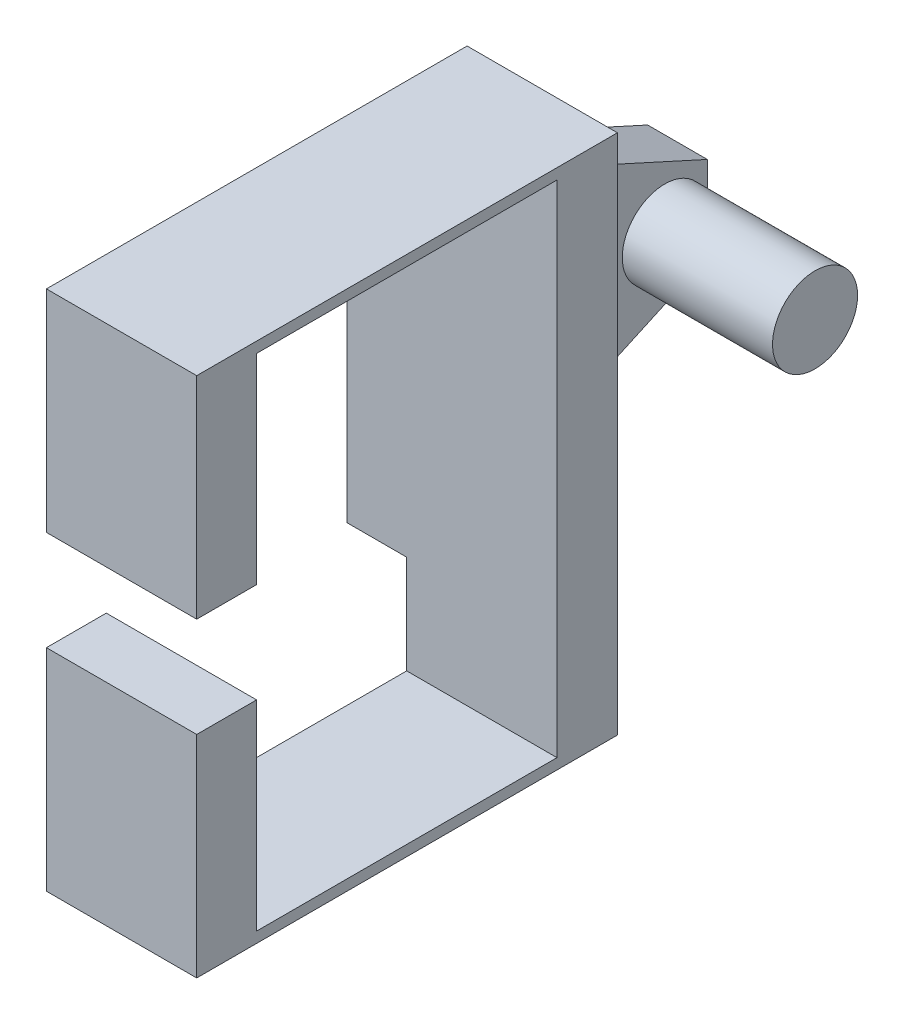
ISO-10303-21;
HEADER;
FILE_DESCRIPTION(('STEP AP214'),'2;1');
FILE_NAME('part.step','',(''),(''),'','','');
FILE_SCHEMA(('AUTOMOTIVE_DESIGN { 1 0 10303 214 1 1 1 1 }'));
ENDSEC;
DATA;
#1=APPLICATION_CONTEXT('core data for automotive mechanical design processes');
#2=APPLICATION_PROTOCOL_DEFINITION('international standard','automotive_design',2000,#1);
#3=PRODUCT_CONTEXT('',#1,'mechanical');
#4=PRODUCT('Part','Part','',(#3));
#5=PRODUCT_RELATED_PRODUCT_CATEGORY('part','',(#4));
#6=PRODUCT_DEFINITION_FORMATION('','',#4);
#7=PRODUCT_DEFINITION_CONTEXT('part definition',#1,'design');
#8=PRODUCT_DEFINITION('design','',#6,#7);
#9=PRODUCT_DEFINITION_SHAPE('','',#8);
#10=(LENGTH_UNIT() NAMED_UNIT(*) SI_UNIT(.MILLI.,.METRE.));
#11=(NAMED_UNIT(*) PLANE_ANGLE_UNIT() SI_UNIT($,.RADIAN.));
#12=(NAMED_UNIT(*) SI_UNIT($,.STERADIAN.) SOLID_ANGLE_UNIT());
#13=UNCERTAINTY_MEASURE_WITH_UNIT(LENGTH_MEASURE(1.E-05),#10,'distance_accuracy_value','');
#14=(GEOMETRIC_REPRESENTATION_CONTEXT(3) GLOBAL_UNCERTAINTY_ASSIGNED_CONTEXT((#13)) GLOBAL_UNIT_ASSIGNED_CONTEXT((#10,
#11,#12)) REPRESENTATION_CONTEXT('',''));
#15=CARTESIAN_POINT('',(0.,0.,0.));
#16=DIRECTION('',(0.,0.,1.));
#17=DIRECTION('',(1.,0.,0.));
#18=AXIS2_PLACEMENT_3D('',#15,#16,#17);
#19=CARTESIAN_POINT('',(0.,0.,0.));
#20=DIRECTION('',(1.,0.,0.));
#21=DIRECTION('',(0.,0.,-1.));
#22=AXIS2_PLACEMENT_3D('',#19,#20,#21);
#23=PLANE('',#22);
#24=DIRECTION('',(0.,0.,1.));
#25=VECTOR('',#24,1.);
#26=CARTESIAN_POINT('',(0.,13.8350809128518,0.));
#27=LINE('',#26,#25);
#28=CARTESIAN_POINT('',(0.,13.8350809128518,0.));
#29=VERTEX_POINT('',#28);
#30=CARTESIAN_POINT('',(0.,13.8350809128518,7.65751071235147));
#31=VERTEX_POINT('',#30);
#32=EDGE_CURVE('E207',#29,#31,#27,.T.);
#33=ORIENTED_EDGE('',*,*,#32,.F.);
#34=DIRECTION('',(0.,1.,0.));
#35=VECTOR('',#34,1.);
#36=CARTESIAN_POINT('',(0.,0.,0.));
#37=LINE('',#36,#35);
#38=CARTESIAN_POINT('',(0.,0.,0.));
#39=VERTEX_POINT('',#38);
#40=EDGE_CURVE('E262',#39,#29,#37,.T.);
#41=ORIENTED_EDGE('',*,*,#40,.F.);
#42=DIRECTION('',(0.,0.,-1.));
#43=VECTOR('',#42,1.);
#44=CARTESIAN_POINT('',(0.,0.,0.));
#45=LINE('',#44,#43);
#46=CARTESIAN_POINT('',(0.,0.,53.3205661447543));
#47=VERTEX_POINT('',#46);
#48=EDGE_CURVE('E242',#47,#39,#45,.T.);
#49=ORIENTED_EDGE('',*,*,#48,.F.);
#50=DIRECTION('',(0.,-1.,0.));
#51=VECTOR('',#50,1.);
#52=CARTESIAN_POINT('',(0.,0.,53.3205661447543));
#53=LINE('',#52,#51);
#54=CARTESIAN_POINT('',(0.,26.7343466598933,53.3205661447543));
#55=VERTEX_POINT('',#54);
#56=EDGE_CURVE('E288',#55,#47,#53,.T.);
#57=ORIENTED_EDGE('',*,*,#56,.F.);
#58=DIRECTION('',(0.,0.,1.));
#59=VECTOR('',#58,1.);
#60=CARTESIAN_POINT('',(0.,26.7343466598933,53.3205661447543));
#61=LINE('',#60,#59);
#62=CARTESIAN_POINT('',(0.,26.7343466598933,45.7321107123515));
#63=VERTEX_POINT('',#62);
#64=EDGE_CURVE('E284',#63,#55,#61,.T.);
#65=ORIENTED_EDGE('',*,*,#64,.F.);
#66=DIRECTION('',(0.,1.,0.));
#67=VECTOR('',#66,1.);
#68=CARTESIAN_POINT('',(0.,26.7343466598933,45.7321107123515));
#69=LINE('',#68,#67);
#70=CARTESIAN_POINT('',(0.,1.35466665989334,45.7321107123515));
#71=VERTEX_POINT('',#70);
#72=EDGE_CURVE('E285',#71,#63,#69,.T.);
#73=ORIENTED_EDGE('',*,*,#72,.F.);
#74=DIRECTION('',(0.,0.,1.));
#75=VECTOR('',#74,1.);
#76=CARTESIAN_POINT('',(0.,1.35466665989334,45.7321107123515));
#77=LINE('',#76,#75);
#78=CARTESIAN_POINT('',(0.,1.35466665989335,7.65751071235147));
#79=VERTEX_POINT('',#78);
#80=EDGE_CURVE('E278',#79,#71,#77,.T.);
#81=ORIENTED_EDGE('',*,*,#80,.F.);
#82=DIRECTION('',(0.,-1.,0.));
#83=VECTOR('',#82,1.);
#84=CARTESIAN_POINT('',(0.,1.35466665989335,7.65751071235147));
#85=LINE('',#84,#83);
#86=EDGE_CURVE('E280',#31,#79,#85,.T.);
#87=ORIENTED_EDGE('',*,*,#86,.F.);
#88=EDGE_LOOP('',(#33,#41,#49,#57,#65,#73,#81,#87));
#89=FACE_BOUND('',#88,.T.);
#90=ADVANCED_FACE('F44',(#89),#23,.F.);
#91=DIRECTION('',(0.,0.,-1.));
#92=VECTOR('',#91,1.);
#93=CARTESIAN_POINT('',(0.,52.2828124069349,0.));
#94=LINE('',#93,#92);
#95=CARTESIAN_POINT('',(0.,52.2828124069349,7.65751071235147));
#96=VERTEX_POINT('',#95);
#97=CARTESIAN_POINT('',(0.,52.2828124069349,0.));
#98=VERTEX_POINT('',#97);
#99=EDGE_CURVE('E66',#96,#98,#94,.T.);
#100=ORIENTED_EDGE('',*,*,#99,.F.);
#101=CARTESIAN_POINT('',(0.,64.7632266598933,7.65751071235147));
#102=VERTEX_POINT('',#101);
#103=EDGE_CURVE('E279',#102,#96,#85,.T.);
#104=ORIENTED_EDGE('',*,*,#103,.F.);
#105=DIRECTION('',(0.,0.,-1.));
#106=VECTOR('',#105,1.);
#107=CARTESIAN_POINT('',(0.,64.7632266598933,45.7321107123515));
#108=LINE('',#107,#106);
#109=CARTESIAN_POINT('',(0.,64.7632266598933,45.7321107123515));
#110=VERTEX_POINT('',#109);
#111=EDGE_CURVE('E274',#110,#102,#108,.T.);
#112=ORIENTED_EDGE('',*,*,#111,.F.);
#113=DIRECTION('',(0.,1.,0.));
#114=VECTOR('',#113,1.);
#115=CARTESIAN_POINT('',(0.,39.3835466598933,45.7321107123515));
#116=LINE('',#115,#114);
#117=CARTESIAN_POINT('',(0.,39.3835466598933,45.7321107123515));
#118=VERTEX_POINT('',#117);
#119=EDGE_CURVE('E272',#118,#110,#116,.T.);
#120=ORIENTED_EDGE('',*,*,#119,.F.);
#121=DIRECTION('',(0.,0.,-1.));
#122=VECTOR('',#121,1.);
#123=CARTESIAN_POINT('',(0.,39.3835466598933,53.3205661447543));
#124=LINE('',#123,#122);
#125=CARTESIAN_POINT('',(0.,39.3835466598933,53.3205661447543));
#126=VERTEX_POINT('',#125);
#127=EDGE_CURVE('E271',#126,#118,#124,.T.);
#128=ORIENTED_EDGE('',*,*,#127,.F.);
#129=DIRECTION('',(0.,-1.,0.));
#130=VECTOR('',#129,1.);
#131=CARTESIAN_POINT('',(0.,66.1178933197867,53.3205661447543));
#132=LINE('',#131,#130);
#133=CARTESIAN_POINT('',(0.,66.1178933197867,53.3205661447543));
#134=VERTEX_POINT('',#133);
#135=EDGE_CURVE('E267',#134,#126,#132,.T.);
#136=ORIENTED_EDGE('',*,*,#135,.F.);
#137=DIRECTION('',(0.,0.,1.));
#138=VECTOR('',#137,1.);
#139=CARTESIAN_POINT('',(0.,66.1178933197867,0.));
#140=LINE('',#139,#138);
#141=CARTESIAN_POINT('',(0.,66.1178933197867,0.));
#142=VERTEX_POINT('',#141);
#143=EDGE_CURVE('E270',#142,#134,#140,.T.);
#144=ORIENTED_EDGE('',*,*,#143,.F.);
#145=EDGE_CURVE('E237',#98,#142,#37,.T.);
#146=ORIENTED_EDGE('',*,*,#145,.F.);
#147=EDGE_LOOP('',(#100,#104,#112,#120,#128,#136,#144,#146));
#148=FACE_BOUND('',#147,.T.);
#149=ADVANCED_FACE('F330',(#148),#23,.F.);
#150=CARTESIAN_POINT('',(19.05,0.,0.));
#151=DIRECTION('',(0.,0.,1.));
#152=DIRECTION('',(1.,0.,0.));
#153=AXIS2_PLACEMENT_3D('',#150,#151,#152);
#154=PLANE('',#153);
#155=ORIENTED_EDGE('',*,*,#40,.T.);
#156=EDGE_CURVE('E58',#29,#98,#37,.T.);
#157=ORIENTED_EDGE('',*,*,#156,.T.);
#158=ORIENTED_EDGE('',*,*,#145,.T.);
#159=DIRECTION('',(-1.,0.,0.));
#160=VECTOR('',#159,1.);
#161=CARTESIAN_POINT('',(19.05,66.1178933197867,0.));
#162=LINE('',#161,#160);
#163=CARTESIAN_POINT('',(19.05,66.1178933197867,0.));
#164=VERTEX_POINT('',#163);
#165=EDGE_CURVE('E11',#164,#142,#162,.T.);
#166=ORIENTED_EDGE('',*,*,#165,.F.);
#167=DIRECTION('',(0.,1.,0.));
#168=VECTOR('',#167,1.);
#169=CARTESIAN_POINT('',(19.05,0.,0.));
#170=LINE('',#169,#168);
#171=CARTESIAN_POINT('',(19.05,0.,0.));
#172=VERTEX_POINT('',#171);
#173=EDGE_CURVE('E240',#172,#164,#170,.T.);
#174=ORIENTED_EDGE('',*,*,#173,.F.);
#175=DIRECTION('',(-1.,0.,0.));
#176=VECTOR('',#175,1.);
#177=CARTESIAN_POINT('',(19.05,0.,0.));
#178=LINE('',#177,#176);
#179=EDGE_CURVE('E263',#172,#39,#178,.T.);
#180=ORIENTED_EDGE('',*,*,#179,.T.);
#181=EDGE_LOOP('',(#155,#157,#158,#166,#174,#180));
#182=FACE_BOUND('',#181,.T.);
#183=ADVANCED_FACE('F50',(#182),#154,.F.);
#184=CARTESIAN_POINT('',(19.05,66.1178933197867,0.));
#185=DIRECTION('',(0.,-1.,0.));
#186=DIRECTION('',(0.,0.,-1.));
#187=AXIS2_PLACEMENT_3D('',#184,#185,#186);
#188=PLANE('',#187);
#189=ORIENTED_EDGE('',*,*,#143,.T.);
#190=DIRECTION('',(-1.,0.,0.));
#191=VECTOR('',#190,1.);
#192=CARTESIAN_POINT('',(19.05,66.1178933197867,53.3205661447543));
#193=LINE('',#192,#191);
#194=CARTESIAN_POINT('',(19.05,66.1178933197867,53.3205661447543));
#195=VERTEX_POINT('',#194);
#196=EDGE_CURVE('E52',#195,#134,#193,.T.);
#197=ORIENTED_EDGE('',*,*,#196,.F.);
#198=DIRECTION('',(0.,0.,1.));
#199=VECTOR('',#198,1.);
#200=CARTESIAN_POINT('',(19.05,66.1178933197867,0.));
#201=LINE('',#200,#199);
#202=EDGE_CURVE('E238',#164,#195,#201,.T.);
#203=ORIENTED_EDGE('',*,*,#202,.F.);
#204=ORIENTED_EDGE('',*,*,#165,.T.);
#205=EDGE_LOOP('',(#189,#197,#203,#204));
#206=FACE_BOUND('',#205,.T.);
#207=ADVANCED_FACE('F342',(#206),#188,.F.);
#208=CARTESIAN_POINT('',(19.05,66.1178933197867,53.3205661447543));
#209=DIRECTION('',(0.,0.,-1.));
#210=DIRECTION('',(-1.,0.,0.));
#211=AXIS2_PLACEMENT_3D('',#208,#209,#210);
#212=PLANE('',#211);
#213=ORIENTED_EDGE('',*,*,#135,.T.);
#214=DIRECTION('',(-1.,0.,0.));
#215=VECTOR('',#214,1.);
#216=CARTESIAN_POINT('',(19.05,39.3835466598933,53.3205661447543));
#217=LINE('',#216,#215);
#218=CARTESIAN_POINT('',(19.05,39.3835466598933,53.3205661447543));
#219=VERTEX_POINT('',#218);
#220=EDGE_CURVE('E312',#219,#126,#217,.T.);
#221=ORIENTED_EDGE('',*,*,#220,.F.);
#222=DIRECTION('',(0.,-1.,0.));
#223=VECTOR('',#222,1.);
#224=CARTESIAN_POINT('',(19.05,66.1178933197867,53.3205661447543));
#225=LINE('',#224,#223);
#226=EDGE_CURVE('E243',#195,#219,#225,.T.);
#227=ORIENTED_EDGE('',*,*,#226,.F.);
#228=ORIENTED_EDGE('',*,*,#196,.T.);
#229=EDGE_LOOP('',(#213,#221,#227,#228));
#230=FACE_BOUND('',#229,.T.);
#231=ADVANCED_FACE('F325',(#230),#212,.F.);
#232=CARTESIAN_POINT('',(19.05,39.3835466598933,53.3205661447543));
#233=DIRECTION('',(0.,1.,0.));
#234=DIRECTION('',(0.,0.,1.));
#235=AXIS2_PLACEMENT_3D('',#232,#233,#234);
#236=PLANE('',#235);
#237=ORIENTED_EDGE('',*,*,#127,.T.);
#238=DIRECTION('',(-1.,0.,0.));
#239=VECTOR('',#238,1.);
#240=CARTESIAN_POINT('',(19.05,39.3835466598933,45.7321107123515));
#241=LINE('',#240,#239);
#242=CARTESIAN_POINT('',(19.05,39.3835466598933,45.7321107123515));
#243=VERTEX_POINT('',#242);
#244=EDGE_CURVE('E315',#243,#118,#241,.T.);
#245=ORIENTED_EDGE('',*,*,#244,.F.);
#246=DIRECTION('',(0.,0.,-1.));
#247=VECTOR('',#246,1.);
#248=CARTESIAN_POINT('',(19.05,39.3835466598933,53.3205661447543));
#249=LINE('',#248,#247);
#250=EDGE_CURVE('E241',#219,#243,#249,.T.);
#251=ORIENTED_EDGE('',*,*,#250,.F.);
#252=ORIENTED_EDGE('',*,*,#220,.T.);
#253=EDGE_LOOP('',(#237,#245,#251,#252));
#254=FACE_BOUND('',#253,.T.);
#255=ADVANCED_FACE('F335',(#254),#236,.F.);
#256=CARTESIAN_POINT('',(19.05,39.3835466598933,45.7321107123515));
#257=DIRECTION('',(0.,0.,1.));
#258=DIRECTION('',(1.,0.,0.));
#259=AXIS2_PLACEMENT_3D('',#256,#257,#258);
#260=PLANE('',#259);
#261=ORIENTED_EDGE('',*,*,#119,.T.);
#262=DIRECTION('',(-1.,0.,0.));
#263=VECTOR('',#262,1.);
#264=CARTESIAN_POINT('',(19.05,64.7632266598933,45.7321107123515));
#265=LINE('',#264,#263);
#266=CARTESIAN_POINT('',(19.05,64.7632266598933,45.7321107123515));
#267=VERTEX_POINT('',#266);
#268=EDGE_CURVE('E310',#267,#110,#265,.T.);
#269=ORIENTED_EDGE('',*,*,#268,.F.);
#270=DIRECTION('',(0.,1.,0.));
#271=VECTOR('',#270,1.);
#272=CARTESIAN_POINT('',(19.05,39.3835466598933,45.7321107123515));
#273=LINE('',#272,#271);
#274=EDGE_CURVE('E250',#243,#267,#273,.T.);
#275=ORIENTED_EDGE('',*,*,#274,.F.);
#276=ORIENTED_EDGE('',*,*,#244,.T.);
#277=EDGE_LOOP('',(#261,#269,#275,#276));
#278=FACE_BOUND('',#277,.T.);
#279=ADVANCED_FACE('F337',(#278),#260,.F.);
#280=CARTESIAN_POINT('',(19.05,64.7632266598933,45.7321107123515));
#281=DIRECTION('',(0.,1.,0.));
#282=DIRECTION('',(0.,0.,1.));
#283=AXIS2_PLACEMENT_3D('',#280,#281,#282);
#284=PLANE('',#283);
#285=ORIENTED_EDGE('',*,*,#111,.T.);
#286=DIRECTION('',(-1.,0.,0.));
#287=VECTOR('',#286,1.);
#288=CARTESIAN_POINT('',(19.05,64.7632266598933,7.65751071235147));
#289=LINE('',#288,#287);
#290=CARTESIAN_POINT('',(19.05,64.7632266598933,7.65751071235147));
#291=VERTEX_POINT('',#290);
#292=EDGE_CURVE('E308',#291,#102,#289,.T.);
#293=ORIENTED_EDGE('',*,*,#292,.F.);
#294=DIRECTION('',(0.,0.,-1.));
#295=VECTOR('',#294,1.);
#296=CARTESIAN_POINT('',(19.05,64.7632266598933,45.7321107123515));
#297=LINE('',#296,#295);
#298=EDGE_CURVE('E247',#267,#291,#297,.T.);
#299=ORIENTED_EDGE('',*,*,#298,.F.);
#300=ORIENTED_EDGE('',*,*,#268,.T.);
#301=EDGE_LOOP('',(#285,#293,#299,#300));
#302=FACE_BOUND('',#301,.T.);
#303=ADVANCED_FACE('F364',(#302),#284,.F.);
#304=CARTESIAN_POINT('',(19.05,1.35466665989335,7.65751071235147));
#305=DIRECTION('',(0.,0.,-1.));
#306=DIRECTION('',(-1.,0.,0.));
#307=AXIS2_PLACEMENT_3D('',#304,#305,#306);
#308=PLANE('',#307);
#309=ORIENTED_EDGE('',*,*,#103,.T.);
#310=DIRECTION('',(-1.,0.,0.));
#311=VECTOR('',#310,1.);
#312=CARTESIAN_POINT('',(40.5341764917601,52.2828124069349,7.65751071235148));
#313=LINE('',#312,#311);
#314=CARTESIAN_POINT('',(-7.56143527171308,52.2828124069349,7.65751071235148));
#315=VERTEX_POINT('',#314);
#316=EDGE_CURVE('E200',#96,#315,#313,.T.);
#317=ORIENTED_EDGE('',*,*,#316,.T.);
#318=DIRECTION('',(0.,1.,0.));
#319=VECTOR('',#318,1.);
#320=CARTESIAN_POINT('',(-7.56143527171308,38.4477314940831,7.65751071235147));
#321=LINE('',#320,#319);
#322=CARTESIAN_POINT('',(-7.56143527171308,13.8350809128518,7.65751071235147));
#323=VERTEX_POINT('',#322);
#324=EDGE_CURVE('E193',#323,#315,#321,.T.);
#325=ORIENTED_EDGE('',*,*,#324,.F.);
#326=DIRECTION('',(-1.,0.,0.));
#327=VECTOR('',#326,1.);
#328=CARTESIAN_POINT('',(40.5341764917601,13.8350809128518,7.65751071235147));
#329=LINE('',#328,#327);
#330=EDGE_CURVE('E209',#31,#323,#329,.T.);
#331=ORIENTED_EDGE('',*,*,#330,.F.);
#332=ORIENTED_EDGE('',*,*,#86,.T.);
#333=DIRECTION('',(-1.,0.,0.));
#334=VECTOR('',#333,1.);
#335=CARTESIAN_POINT('',(19.05,1.35466665989335,7.65751071235147));
#336=LINE('',#335,#334);
#337=CARTESIAN_POINT('',(19.05,1.35466665989335,7.65751071235147));
#338=VERTEX_POINT('',#337);
#339=EDGE_CURVE('E301',#338,#79,#336,.T.);
#340=ORIENTED_EDGE('',*,*,#339,.F.);
#341=DIRECTION('',(0.,-1.,0.));
#342=VECTOR('',#341,1.);
#343=CARTESIAN_POINT('',(19.05,1.35466665989335,7.65751071235147));
#344=LINE('',#343,#342);
#345=EDGE_CURVE('E253',#291,#338,#344,.T.);
#346=ORIENTED_EDGE('',*,*,#345,.F.);
#347=ORIENTED_EDGE('',*,*,#292,.T.);
#348=EDGE_LOOP('',(#309,#317,#325,#331,#332,#340,#346,#347));
#349=FACE_BOUND('',#348,.T.);
#350=ADVANCED_FACE('F363',(#349),#308,.F.);
#351=CARTESIAN_POINT('',(19.05,1.35466665989334,45.7321107123515));
#352=DIRECTION('',(0.,-1.,0.));
#353=DIRECTION('',(0.,0.,-1.));
#354=AXIS2_PLACEMENT_3D('',#351,#352,#353);
#355=PLANE('',#354);
#356=ORIENTED_EDGE('',*,*,#80,.T.);
#357=DIRECTION('',(-1.,0.,0.));
#358=VECTOR('',#357,1.);
#359=CARTESIAN_POINT('',(19.05,1.35466665989334,45.7321107123515));
#360=LINE('',#359,#358);
#361=CARTESIAN_POINT('',(19.05,1.35466665989334,45.7321107123515));
#362=VERTEX_POINT('',#361);
#363=EDGE_CURVE('E296',#362,#71,#360,.T.);
#364=ORIENTED_EDGE('',*,*,#363,.F.);
#365=DIRECTION('',(0.,0.,1.));
#366=VECTOR('',#365,1.);
#367=CARTESIAN_POINT('',(19.05,1.35466665989334,45.7321107123515));
#368=LINE('',#367,#366);
#369=EDGE_CURVE('E251',#338,#362,#368,.T.);
#370=ORIENTED_EDGE('',*,*,#369,.F.);
#371=ORIENTED_EDGE('',*,*,#339,.T.);
#372=EDGE_LOOP('',(#356,#364,#370,#371));
#373=FACE_BOUND('',#372,.T.);
#374=ADVANCED_FACE('F371',(#373),#355,.F.);
#375=CARTESIAN_POINT('',(19.05,26.7343466598933,45.7321107123515));
#376=DIRECTION('',(0.,0.,1.));
#377=DIRECTION('',(1.,0.,0.));
#378=AXIS2_PLACEMENT_3D('',#375,#376,#377);
#379=PLANE('',#378);
#380=ORIENTED_EDGE('',*,*,#72,.T.);
#381=DIRECTION('',(-1.,0.,0.));
#382=VECTOR('',#381,1.);
#383=CARTESIAN_POINT('',(19.05,26.7343466598933,45.7321107123515));
#384=LINE('',#383,#382);
#385=CARTESIAN_POINT('',(19.05,26.7343466598933,45.7321107123515));
#386=VERTEX_POINT('',#385);
#387=EDGE_CURVE('E300',#386,#63,#384,.T.);
#388=ORIENTED_EDGE('',*,*,#387,.F.);
#389=DIRECTION('',(0.,1.,0.));
#390=VECTOR('',#389,1.);
#391=CARTESIAN_POINT('',(19.05,26.7343466598933,45.7321107123515));
#392=LINE('',#391,#390);
#393=EDGE_CURVE('E254',#362,#386,#392,.T.);
#394=ORIENTED_EDGE('',*,*,#393,.F.);
#395=ORIENTED_EDGE('',*,*,#363,.T.);
#396=EDGE_LOOP('',(#380,#388,#394,#395));
#397=FACE_BOUND('',#396,.T.);
#398=ADVANCED_FACE('F374',(#397),#379,.F.);
#399=CARTESIAN_POINT('',(19.05,26.7343466598933,53.3205661447543));
#400=DIRECTION('',(0.,-1.,0.));
#401=DIRECTION('',(0.,0.,-1.));
#402=AXIS2_PLACEMENT_3D('',#399,#400,#401);
#403=PLANE('',#402);
#404=ORIENTED_EDGE('',*,*,#64,.T.);
#405=DIRECTION('',(-1.,0.,0.));
#406=VECTOR('',#405,1.);
#407=CARTESIAN_POINT('',(19.05,26.7343466598933,53.3205661447543));
#408=LINE('',#407,#406);
#409=CARTESIAN_POINT('',(19.05,26.7343466598933,53.3205661447543));
#410=VERTEX_POINT('',#409);
#411=EDGE_CURVE('E294',#410,#55,#408,.T.);
#412=ORIENTED_EDGE('',*,*,#411,.F.);
#413=DIRECTION('',(0.,0.,1.));
#414=VECTOR('',#413,1.);
#415=CARTESIAN_POINT('',(19.05,26.7343466598933,53.3205661447543));
#416=LINE('',#415,#414);
#417=EDGE_CURVE('E260',#386,#410,#416,.T.);
#418=ORIENTED_EDGE('',*,*,#417,.F.);
#419=ORIENTED_EDGE('',*,*,#387,.T.);
#420=EDGE_LOOP('',(#404,#412,#418,#419));
#421=FACE_BOUND('',#420,.T.);
#422=ADVANCED_FACE('F379',(#421),#403,.F.);
#423=CARTESIAN_POINT('',(19.05,0.,53.3205661447543));
#424=DIRECTION('',(0.,0.,-1.));
#425=DIRECTION('',(-1.,0.,0.));
#426=AXIS2_PLACEMENT_3D('',#423,#424,#425);
#427=PLANE('',#426);
#428=ORIENTED_EDGE('',*,*,#56,.T.);
#429=DIRECTION('',(-1.,0.,0.));
#430=VECTOR('',#429,1.);
#431=CARTESIAN_POINT('',(19.05,0.,53.3205661447543));
#432=LINE('',#431,#430);
#433=CARTESIAN_POINT('',(19.05,0.,53.3205661447543));
#434=VERTEX_POINT('',#433);
#435=EDGE_CURVE('E292',#434,#47,#432,.T.);
#436=ORIENTED_EDGE('',*,*,#435,.F.);
#437=DIRECTION('',(0.,-1.,0.));
#438=VECTOR('',#437,1.);
#439=CARTESIAN_POINT('',(19.05,0.,53.3205661447543));
#440=LINE('',#439,#438);
#441=EDGE_CURVE('E259',#410,#434,#440,.T.);
#442=ORIENTED_EDGE('',*,*,#441,.F.);
#443=ORIENTED_EDGE('',*,*,#411,.T.);
#444=EDGE_LOOP('',(#428,#436,#442,#443));
#445=FACE_BOUND('',#444,.T.);
#446=ADVANCED_FACE('F387',(#445),#427,.F.);
#447=CARTESIAN_POINT('',(19.05,0.,0.));
#448=DIRECTION('',(0.,1.,0.));
#449=DIRECTION('',(0.,0.,1.));
#450=AXIS2_PLACEMENT_3D('',#447,#448,#449);
#451=PLANE('',#450);
#452=ORIENTED_EDGE('',*,*,#48,.T.);
#453=ORIENTED_EDGE('',*,*,#179,.F.);
#454=DIRECTION('',(0.,0.,-1.));
#455=VECTOR('',#454,1.);
#456=CARTESIAN_POINT('',(19.05,0.,0.));
#457=LINE('',#456,#455);
#458=EDGE_CURVE('E261',#434,#172,#457,.T.);
#459=ORIENTED_EDGE('',*,*,#458,.F.);
#460=ORIENTED_EDGE('',*,*,#435,.T.);
#461=EDGE_LOOP('',(#452,#453,#459,#460));
#462=FACE_BOUND('',#461,.T.);
#463=ADVANCED_FACE('F388',(#462),#451,.F.);
#464=CARTESIAN_POINT('',(19.05,0.,0.));
#465=DIRECTION('',(1.,0.,0.));
#466=DIRECTION('',(0.,0.,-1.));
#467=AXIS2_PLACEMENT_3D('',#464,#465,#466);
#468=PLANE('',#467);
#469=ORIENTED_EDGE('',*,*,#173,.T.);
#470=ORIENTED_EDGE('',*,*,#202,.T.);
#471=ORIENTED_EDGE('',*,*,#226,.T.);
#472=ORIENTED_EDGE('',*,*,#250,.T.);
#473=ORIENTED_EDGE('',*,*,#274,.T.);
#474=ORIENTED_EDGE('',*,*,#298,.T.);
#475=ORIENTED_EDGE('',*,*,#345,.T.);
#476=ORIENTED_EDGE('',*,*,#369,.T.);
#477=ORIENTED_EDGE('',*,*,#393,.T.);
#478=ORIENTED_EDGE('',*,*,#417,.T.);
#479=ORIENTED_EDGE('',*,*,#441,.T.);
#480=ORIENTED_EDGE('',*,*,#458,.T.);
#481=EDGE_LOOP('',(#469,#470,#471,#472,#473,#474,#475,#476,#477,#478,#479,#480));
#482=FACE_BOUND('',#481,.T.);
#483=ADVANCED_FACE('F336',(#482),#468,.T.);
#484=CARTESIAN_POINT('',(-7.56143527171308,38.4477314940831,-30.4424892876485));
#485=DIRECTION('',(0.,0.,1.));
#486=DIRECTION('',(1.,0.,0.));
#487=AXIS2_PLACEMENT_3D('',#484,#485,#486);
#488=PLANE('',#487);
#489=DIRECTION('',(0.,-1.,0.));
#490=VECTOR('',#489,1.);
#491=CARTESIAN_POINT('',(0.,38.4477314940831,-30.4424892876485));
#492=LINE('',#491,#490);
#493=CARTESIAN_POINT('',(0.,38.4477314940831,-30.4424892876485));
#494=VERTEX_POINT('',#493);
#495=CARTESIAN_POINT('',(0.,33.0589466598933,-30.4424892876485));
#496=VERTEX_POINT('',#495);
#497=EDGE_CURVE('E228',#494,#496,#492,.T.);
#498=ORIENTED_EDGE('',*,*,#497,.T.);
#499=CARTESIAN_POINT('',(0.,27.6701618257036,-30.4424892876485));
#500=VERTEX_POINT('',#499);
#501=EDGE_CURVE('E221',#496,#500,#492,.T.);
#502=ORIENTED_EDGE('',*,*,#501,.T.);
#503=DIRECTION('',(1.,0.,0.));
#504=VECTOR('',#503,1.);
#505=CARTESIAN_POINT('',(-7.56143527171308,27.6701618257036,-30.4424892876485));
#506=LINE('',#505,#504);
#507=CARTESIAN_POINT('',(-7.56143527171308,27.6701618257036,-30.4424892876485));
#508=VERTEX_POINT('',#507);
#509=EDGE_CURVE('E226',#508,#500,#506,.T.);
#510=ORIENTED_EDGE('',*,*,#509,.F.);
#511=DIRECTION('',(0.,-1.,0.));
#512=VECTOR('',#511,1.);
#513=CARTESIAN_POINT('',(-7.56143527171308,38.4477314940831,-30.4424892876485));
#514=LINE('',#513,#512);
#515=CARTESIAN_POINT('',(-7.56143527171308,38.4477314940831,-30.4424892876485));
#516=VERTEX_POINT('',#515);
#517=EDGE_CURVE('E227',#516,#508,#514,.T.);
#518=ORIENTED_EDGE('',*,*,#517,.F.);
#519=DIRECTION('',(1.,0.,0.));
#520=VECTOR('',#519,1.);
#521=CARTESIAN_POINT('',(-7.56143527171308,38.4477314940831,-30.4424892876485));
#522=LINE('',#521,#520);
#523=EDGE_CURVE('E196',#516,#494,#522,.T.);
#524=ORIENTED_EDGE('',*,*,#523,.T.);
#525=EDGE_LOOP('',(#498,#502,#510,#518,#524));
#526=FACE_BOUND('',#525,.T.);
#527=ADVANCED_FACE('F348',(#526),#488,.F.);
#528=CARTESIAN_POINT('',(-7.56143527171308,0.,0.));
#529=DIRECTION('',(-1.,0.,0.));
#530=DIRECTION('',(0.,0.,1.));
#531=AXIS2_PLACEMENT_3D('',#528,#529,#530);
#532=PLANE('',#531);
#533=ORIENTED_EDGE('',*,*,#324,.T.);
#534=DIRECTION('',(0.,0.,-1.));
#535=VECTOR('',#534,1.);
#536=CARTESIAN_POINT('',(-7.56143527171308,52.2828124069349,0.));
#537=LINE('',#536,#535);
#538=CARTESIAN_POINT('',(-7.56143527171308,52.2828124069349,0.));
#539=VERTEX_POINT('',#538);
#540=EDGE_CURVE('E179',#315,#539,#537,.T.);
#541=ORIENTED_EDGE('',*,*,#540,.T.);
#542=DIRECTION('',(0.,-0.413743108028006,-0.910393673395925));
#543=VECTOR('',#542,1.);
#544=CARTESIAN_POINT('',(-7.56143527171308,38.4477314940831,-30.4424892876485));
#545=LINE('',#544,#543);
#546=EDGE_CURVE('E189',#539,#516,#545,.T.);
#547=ORIENTED_EDGE('',*,*,#546,.T.);
#548=ORIENTED_EDGE('',*,*,#517,.T.);
#549=DIRECTION('',(0.,-0.413743108028007,0.910393673395925));
#550=VECTOR('',#549,1.);
#551=CARTESIAN_POINT('',(-7.56143527171308,27.6701618257036,-30.4424892876485));
#552=LINE('',#551,#550);
#553=CARTESIAN_POINT('',(-7.56143527171308,13.8350809128518,0.));
#554=VERTEX_POINT('',#553);
#555=EDGE_CURVE('E191',#508,#554,#552,.T.);
#556=ORIENTED_EDGE('',*,*,#555,.T.);
#557=DIRECTION('',(0.,0.,1.));
#558=VECTOR('',#557,1.);
#559=CARTESIAN_POINT('',(-7.56143527171308,13.8350809128518,0.));
#560=LINE('',#559,#558);
#561=EDGE_CURVE('E220',#554,#323,#560,.T.);
#562=ORIENTED_EDGE('',*,*,#561,.T.);
#563=EDGE_LOOP('',(#533,#541,#547,#548,#556,#562));
#564=FACE_BOUND('',#563,.T.);
#565=ADVANCED_FACE('F188',(#564),#532,.T.);
#566=CARTESIAN_POINT('',(0.,0.,0.));
#567=DIRECTION('',(-1.,0.,0.));
#568=DIRECTION('',(0.,0.,1.));
#569=AXIS2_PLACEMENT_3D('',#566,#567,#568);
#570=PLANE('',#569);
#571=ORIENTED_EDGE('',*,*,#501,.F.);
#572=CARTESIAN_POINT('',(0.,33.0589466598933,-25.0537044534588));
#573=DIRECTION('',(1.,0.,0.));
#574=DIRECTION('',(0.,0.,-1.));
#575=AXIS2_PLACEMENT_3D('',#572,#573,#574);
#576=CIRCLE('',#575,5.38878483418973);
#577=EDGE_CURVE('E204',#496,#496,#576,.T.);
#578=ORIENTED_EDGE('',*,*,#577,.F.);
#579=ORIENTED_EDGE('',*,*,#497,.F.);
#580=DIRECTION('',(0.,-0.413743108028006,-0.910393673395925));
#581=VECTOR('',#580,1.);
#582=CARTESIAN_POINT('',(0.,38.4477314940831,-30.4424892876485));
#583=LINE('',#582,#581);
#584=EDGE_CURVE('E184',#98,#494,#583,.T.);
#585=ORIENTED_EDGE('',*,*,#584,.F.);
#586=ORIENTED_EDGE('',*,*,#156,.F.);
#587=DIRECTION('',(0.,-0.413743108028006,0.910393673395925));
#588=VECTOR('',#587,1.);
#589=CARTESIAN_POINT('',(0.,27.6701618257036,-30.4424892876485));
#590=LINE('',#589,#588);
#591=EDGE_CURVE('E208',#500,#29,#590,.T.);
#592=ORIENTED_EDGE('',*,*,#591,.F.);
#593=EDGE_LOOP('',(#571,#578,#579,#585,#586,#592));
#594=FACE_BOUND('',#593,.T.);
#595=ADVANCED_FACE('F350',(#594),#570,.F.);
#596=CARTESIAN_POINT('',(19.05,33.0589466598933,-25.0537044534588));
#597=DIRECTION('',(-1.,0.,0.));
#598=DIRECTION('',(0.,0.,1.));
#599=AXIS2_PLACEMENT_3D('',#596,#597,#598);
#600=CYLINDRICAL_SURFACE('',#599,5.38878483418973);
#601=CARTESIAN_POINT('',(19.05,33.0589466598933,-25.0537044534588));
#602=DIRECTION('',(1.,0.,0.));
#603=DIRECTION('',(0.,0.,-1.));
#604=AXIS2_PLACEMENT_3D('',#601,#602,#603);
#605=CIRCLE('',#604,5.38878483418973);
#606=CARTESIAN_POINT('',(19.05,33.0589466598933,-30.4424892876485));
#607=VERTEX_POINT('',#606);
#608=EDGE_CURVE('E222',#607,#607,#605,.T.);
#609=ORIENTED_EDGE('',*,*,#608,.F.);
#610=EDGE_LOOP('',(#609));
#611=FACE_BOUND('',#610,.T.);
#612=ORIENTED_EDGE('',*,*,#577,.T.);
#613=EDGE_LOOP('',(#612));
#614=FACE_BOUND('',#613,.T.);
#615=ADVANCED_FACE('F460',(#611,#614),#600,.T.);
#616=CARTESIAN_POINT('',(19.05,33.0589466598933,-25.0537044534588));
#617=DIRECTION('',(1.,0.,0.));
#618=DIRECTION('',(0.,0.,-1.));
#619=AXIS2_PLACEMENT_3D('',#616,#617,#618);
#620=PLANE('',#619);
#621=ORIENTED_EDGE('',*,*,#608,.T.);
#622=EDGE_LOOP('',(#621));
#623=FACE_BOUND('',#622,.T.);
#624=ADVANCED_FACE('F461',(#623),#620,.T.);
#625=CARTESIAN_POINT('',(40.5341764917601,27.6701618257036,-30.4424892876485));
#626=DIRECTION('',(0.,-0.910393673395925,-0.413743108028006));
#627=DIRECTION('',(0.,0.413743108028006,-0.910393673395925));
#628=AXIS2_PLACEMENT_3D('',#625,#626,#627);
#629=PLANE('',#628);
#630=ORIENTED_EDGE('',*,*,#509,.T.);
#631=ORIENTED_EDGE('',*,*,#591,.T.);
#632=DIRECTION('',(-1.,0.,0.));
#633=VECTOR('',#632,1.);
#634=CARTESIAN_POINT('',(40.5341764917601,13.8350809128518,0.));
#635=LINE('',#634,#633);
#636=EDGE_CURVE('E206',#29,#554,#635,.T.);
#637=ORIENTED_EDGE('',*,*,#636,.T.);
#638=ORIENTED_EDGE('',*,*,#555,.F.);
#639=EDGE_LOOP('',(#630,#631,#637,#638));
#640=FACE_BOUND('',#639,.T.);
#641=ADVANCED_FACE('F351',(#640),#629,.T.);
#642=CARTESIAN_POINT('',(40.5341764917601,13.8350809128518,0.));
#643=DIRECTION('',(0.,-1.,0.));
#644=DIRECTION('',(0.,0.,-1.));
#645=AXIS2_PLACEMENT_3D('',#642,#643,#644);
#646=PLANE('',#645);
#647=ORIENTED_EDGE('',*,*,#636,.F.);
#648=ORIENTED_EDGE('',*,*,#32,.T.);
#649=ORIENTED_EDGE('',*,*,#330,.T.);
#650=ORIENTED_EDGE('',*,*,#561,.F.);
#651=EDGE_LOOP('',(#647,#648,#649,#650));
#652=FACE_BOUND('',#651,.T.);
#653=ADVANCED_FACE('F356',(#652),#646,.T.);
#654=CARTESIAN_POINT('',(40.5341764917601,52.2828124069349,0.));
#655=DIRECTION('',(0.,1.,0.));
#656=DIRECTION('',(0.,0.,1.));
#657=AXIS2_PLACEMENT_3D('',#654,#655,#656);
#658=PLANE('',#657);
#659=ORIENTED_EDGE('',*,*,#316,.F.);
#660=ORIENTED_EDGE('',*,*,#99,.T.);
#661=DIRECTION('',(-1.,0.,0.));
#662=VECTOR('',#661,1.);
#663=CARTESIAN_POINT('',(40.5341764917601,52.2828124069349,0.));
#664=LINE('',#663,#662);
#665=EDGE_CURVE('E178',#98,#539,#664,.T.);
#666=ORIENTED_EDGE('',*,*,#665,.T.);
#667=ORIENTED_EDGE('',*,*,#540,.F.);
#668=EDGE_LOOP('',(#659,#660,#666,#667));
#669=FACE_BOUND('',#668,.T.);
#670=ADVANCED_FACE('F177',(#669),#658,.T.);
#671=CARTESIAN_POINT('',(40.5341764917601,38.4477314940831,-30.4424892876485));
#672=DIRECTION('',(0.,0.910393673395925,-0.413743108028006));
#673=DIRECTION('',(0.,0.413743108028006,0.910393673395925));
#674=AXIS2_PLACEMENT_3D('',#671,#672,#673);
#675=PLANE('',#674);
#676=ORIENTED_EDGE('',*,*,#665,.F.);
#677=ORIENTED_EDGE('',*,*,#584,.T.);
#678=ORIENTED_EDGE('',*,*,#523,.F.);
#679=ORIENTED_EDGE('',*,*,#546,.F.);
#680=EDGE_LOOP('',(#676,#677,#678,#679));
#681=FACE_BOUND('',#680,.T.);
#682=ADVANCED_FACE('F198',(#681),#675,.T.);
#683=CLOSED_SHELL('',(#90,#149,#183,#207,#231,#255,#279,#303,#350,#374,#398,#422,#446,#463,#483,
#527,#565,#595,#615,#624,#641,#653,#670,#682));
#684=MANIFOLD_SOLID_BREP('B2',#683);
#685=ADVANCED_BREP_SHAPE_REPRESENTATION('',(#18,#684),#14);
#686=SHAPE_DEFINITION_REPRESENTATION(#9,#685);
ENDSEC;
END-ISO-10303-21;
